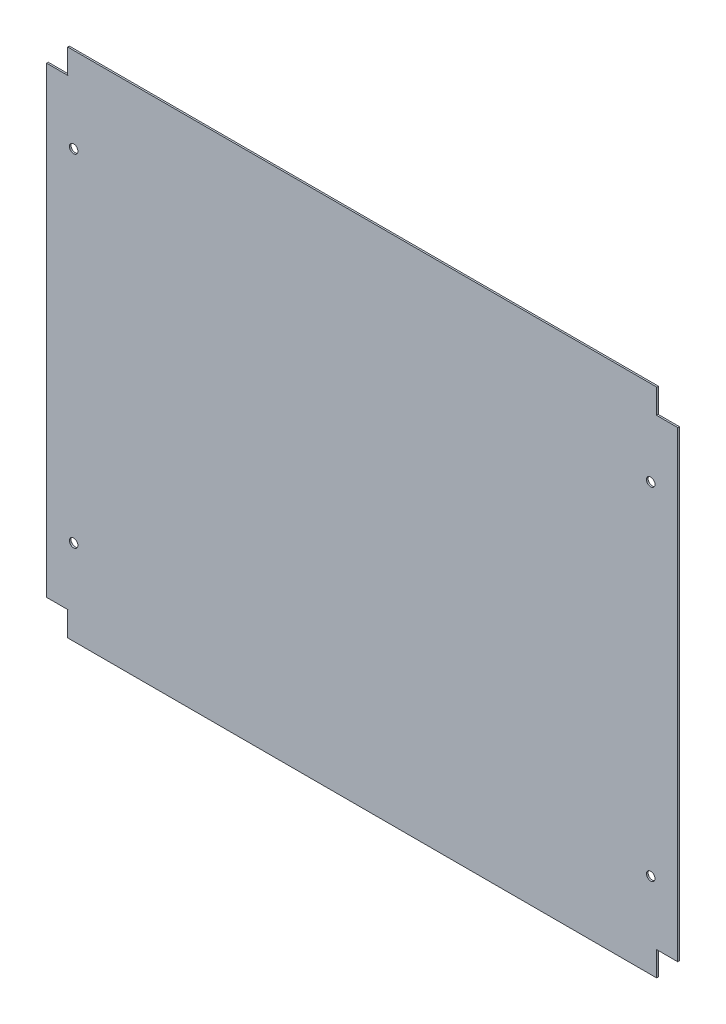
ISO-10303-21;
HEADER;
FILE_DESCRIPTION(('STEP AP214'),'2;1');
FILE_NAME('part.step','',(''),(''),'','','');
FILE_SCHEMA(('AUTOMOTIVE_DESIGN { 1 0 10303 214 1 1 1 1 }'));
ENDSEC;
DATA;
#1=APPLICATION_CONTEXT('core data for automotive mechanical design processes');
#2=APPLICATION_PROTOCOL_DEFINITION('international standard','automotive_design',2000,#1);
#3=PRODUCT_CONTEXT('',#1,'mechanical');
#4=PRODUCT('Part','Part','',(#3));
#5=PRODUCT_RELATED_PRODUCT_CATEGORY('part','',(#4));
#6=PRODUCT_DEFINITION_FORMATION('','',#4);
#7=PRODUCT_DEFINITION_CONTEXT('part definition',#1,'design');
#8=PRODUCT_DEFINITION('design','',#6,#7);
#9=PRODUCT_DEFINITION_SHAPE('','',#8);
#10=(LENGTH_UNIT() NAMED_UNIT(*) SI_UNIT(.MILLI.,.METRE.));
#11=(NAMED_UNIT(*) PLANE_ANGLE_UNIT() SI_UNIT($,.RADIAN.));
#12=(NAMED_UNIT(*) SI_UNIT($,.STERADIAN.) SOLID_ANGLE_UNIT());
#13=UNCERTAINTY_MEASURE_WITH_UNIT(LENGTH_MEASURE(1.E-05),#10,'distance_accuracy_value','');
#14=(GEOMETRIC_REPRESENTATION_CONTEXT(3) GLOBAL_UNCERTAINTY_ASSIGNED_CONTEXT((#13)) GLOBAL_UNIT_ASSIGNED_CONTEXT((#10,
#11,#12)) REPRESENTATION_CONTEXT('',''));
#15=CARTESIAN_POINT('',(0.,0.,0.));
#16=DIRECTION('',(0.,0.,1.));
#17=DIRECTION('',(1.,0.,0.));
#18=AXIS2_PLACEMENT_3D('',#15,#16,#17);
#19=CARTESIAN_POINT('',(-273.7866,215.2904,-1.52399999999997));
#20=DIRECTION('',(-1.,0.,0.));
#21=DIRECTION('',(0.,0.,1.));
#22=AXIS2_PLACEMENT_3D('',#19,#20,#21);
#23=PLANE('',#22);
#24=DIRECTION('',(0.,0.,1.));
#25=VECTOR('',#24,1.);
#26=CARTESIAN_POINT('',(-273.7866,215.138,-1.52399999999997));
#27=LINE('',#26,#25);
#28=CARTESIAN_POINT('',(-273.7866,215.138,-1.524));
#29=VERTEX_POINT('',#28);
#30=CARTESIAN_POINT('',(-273.7866,215.138,0.));
#31=VERTEX_POINT('',#30);
#32=EDGE_CURVE('E391',#29,#31,#27,.T.);
#33=ORIENTED_EDGE('',*,*,#32,.T.);
#34=DIRECTION('',(0.,1.,0.));
#35=VECTOR('',#34,1.);
#36=CARTESIAN_POINT('',(-273.7866,0.,0.));
#37=LINE('',#36,#35);
#38=CARTESIAN_POINT('',(-273.7866,215.2904,0.));
#39=VERTEX_POINT('',#38);
#40=EDGE_CURVE('E13',#31,#39,#37,.T.);
#41=ORIENTED_EDGE('',*,*,#40,.T.);
#42=DIRECTION('',(0.,0.,1.));
#43=VECTOR('',#42,1.);
#44=CARTESIAN_POINT('',(-273.7866,215.2904,-1.52399999999997));
#45=LINE('',#44,#43);
#46=CARTESIAN_POINT('',(-273.7866,215.2904,-1.524));
#47=VERTEX_POINT('',#46);
#48=EDGE_CURVE('E388',#47,#39,#45,.T.);
#49=ORIENTED_EDGE('',*,*,#48,.F.);
#50=DIRECTION('',(0.,-1.,0.));
#51=VECTOR('',#50,1.);
#52=CARTESIAN_POINT('',(-273.7866,215.2904,-1.52399999999997));
#53=LINE('',#52,#51);
#54=EDGE_CURVE('E146',#47,#29,#53,.T.);
#55=ORIENTED_EDGE('',*,*,#54,.T.);
#56=EDGE_LOOP('',(#33,#41,#49,#55));
#57=FACE_BOUND('',#56,.T.);
#58=ADVANCED_FACE('F130',(#57),#23,.T.);
#59=CARTESIAN_POINT('',(-273.7866,-215.138,-1.52399999999997));
#60=DIRECTION('',(-1.,0.,0.));
#61=DIRECTION('',(0.,0.,1.));
#62=AXIS2_PLACEMENT_3D('',#59,#60,#61);
#63=PLANE('',#62);
#64=DIRECTION('',(0.,0.,1.));
#65=VECTOR('',#64,1.);
#66=CARTESIAN_POINT('',(-273.7866,-215.2904,-1.52399999999997));
#67=LINE('',#66,#65);
#68=CARTESIAN_POINT('',(-273.7866,-215.2904,-1.524));
#69=VERTEX_POINT('',#68);
#70=CARTESIAN_POINT('',(-273.7866,-215.2904,0.));
#71=VERTEX_POINT('',#70);
#72=EDGE_CURVE('E378',#69,#71,#67,.T.);
#73=ORIENTED_EDGE('',*,*,#72,.T.);
#74=DIRECTION('',(0.,1.,0.));
#75=VECTOR('',#74,1.);
#76=CARTESIAN_POINT('',(-273.7866,0.,0.));
#77=LINE('',#76,#75);
#78=CARTESIAN_POINT('',(-273.7866,-215.138,0.));
#79=VERTEX_POINT('',#78);
#80=EDGE_CURVE('E139',#71,#79,#77,.T.);
#81=ORIENTED_EDGE('',*,*,#80,.T.);
#82=DIRECTION('',(0.,0.,1.));
#83=VECTOR('',#82,1.);
#84=CARTESIAN_POINT('',(-273.7866,-215.138,-1.52399999999997));
#85=LINE('',#84,#83);
#86=CARTESIAN_POINT('',(-273.7866,-215.138,-1.524));
#87=VERTEX_POINT('',#86);
#88=EDGE_CURVE('E400',#87,#79,#85,.T.);
#89=ORIENTED_EDGE('',*,*,#88,.F.);
#90=DIRECTION('',(0.,-1.,0.));
#91=VECTOR('',#90,1.);
#92=CARTESIAN_POINT('',(-273.7866,-215.138,-1.52399999999997));
#93=LINE('',#92,#91);
#94=EDGE_CURVE('E396',#87,#69,#93,.T.);
#95=ORIENTED_EDGE('',*,*,#94,.T.);
#96=EDGE_LOOP('',(#73,#81,#89,#95));
#97=FACE_BOUND('',#96,.T.);
#98=ADVANCED_FACE('F529',(#97),#63,.T.);
#99=CARTESIAN_POINT('',(-273.7866,-215.2904,-1.52399999999997));
#100=DIRECTION('',(0.,1.,0.));
#101=DIRECTION('',(0.,0.,1.));
#102=AXIS2_PLACEMENT_3D('',#99,#100,#101);
#103=PLANE('',#102);
#104=DIRECTION('',(0.,0.,1.));
#105=VECTOR('',#104,1.);
#106=CARTESIAN_POINT('',(-273.939,-215.2904,-1.525));
#107=LINE('',#106,#105);
#108=CARTESIAN_POINT('',(-273.939,-215.2904,-1.524));
#109=VERTEX_POINT('',#108);
#110=CARTESIAN_POINT('',(-273.939,-215.2904,0.));
#111=VERTEX_POINT('',#110);
#112=EDGE_CURVE('E521',#109,#111,#107,.T.);
#113=ORIENTED_EDGE('',*,*,#112,.T.);
#114=DIRECTION('',(1.,0.,0.));
#115=VECTOR('',#114,1.);
#116=CARTESIAN_POINT('',(0.,-215.2904,0.));
#117=LINE('',#116,#115);
#118=EDGE_CURVE('E425',#111,#71,#117,.T.);
#119=ORIENTED_EDGE('',*,*,#118,.T.);
#120=ORIENTED_EDGE('',*,*,#72,.F.);
#121=DIRECTION('',(-1.,0.,0.));
#122=VECTOR('',#121,1.);
#123=CARTESIAN_POINT('',(-273.7866,-215.2904,-1.52399999999997));
#124=LINE('',#123,#122);
#125=EDGE_CURVE('E401',#69,#109,#124,.T.);
#126=ORIENTED_EDGE('',*,*,#125,.T.);
#127=EDGE_LOOP('',(#113,#119,#120,#126));
#128=FACE_BOUND('',#127,.T.);
#129=ADVANCED_FACE('F537',(#128),#103,.T.);
#130=CARTESIAN_POINT('',(-276.987,215.2904,-1.52399999999997));
#131=DIRECTION('',(0.,-1.,0.));
#132=DIRECTION('',(0.,0.,-1.));
#133=AXIS2_PLACEMENT_3D('',#130,#131,#132);
#134=PLANE('',#133);
#135=ORIENTED_EDGE('',*,*,#48,.T.);
#136=DIRECTION('',(-1.,0.,0.));
#137=VECTOR('',#136,1.);
#138=CARTESIAN_POINT('',(0.,215.2904,0.));
#139=LINE('',#138,#137);
#140=CARTESIAN_POINT('',(-273.939,215.2904,0.));
#141=VERTEX_POINT('',#140);
#142=EDGE_CURVE('E421',#39,#141,#139,.T.);
#143=ORIENTED_EDGE('',*,*,#142,.T.);
#144=DIRECTION('',(0.,0.,-1.));
#145=VECTOR('',#144,1.);
#146=CARTESIAN_POINT('',(-273.939,215.2904,-1.525));
#147=LINE('',#146,#145);
#148=CARTESIAN_POINT('',(-273.939,215.2904,-1.52399999999997));
#149=VERTEX_POINT('',#148);
#150=EDGE_CURVE('E517',#141,#149,#147,.T.);
#151=ORIENTED_EDGE('',*,*,#150,.T.);
#152=DIRECTION('',(1.,0.,0.));
#153=VECTOR('',#152,1.);
#154=CARTESIAN_POINT('',(-276.987,215.2904,-1.52399999999997));
#155=LINE('',#154,#153);
#156=EDGE_CURVE('E382',#149,#47,#155,.T.);
#157=ORIENTED_EDGE('',*,*,#156,.T.);
#158=EDGE_LOOP('',(#135,#143,#151,#157));
#159=FACE_BOUND('',#158,.T.);
#160=ADVANCED_FACE('F590',(#159),#134,.T.);
#161=CARTESIAN_POINT('',(-273.7866,215.138,-1.52399999999997));
#162=DIRECTION('',(0.,1.,0.));
#163=DIRECTION('',(0.,0.,1.));
#164=AXIS2_PLACEMENT_3D('',#161,#162,#163);
#165=PLANE('',#164);
#166=DIRECTION('',(-1.,0.,0.));
#167=VECTOR('',#166,1.);
#168=CARTESIAN_POINT('',(-273.7866,215.138,-1.52399999999997));
#169=LINE('',#168,#167);
#170=CARTESIAN_POINT('',(-293.483962531012,215.138,-1.52399999999991));
#171=VERTEX_POINT('',#170);
#172=EDGE_CURVE('E151',#29,#171,#169,.T.);
#173=ORIENTED_EDGE('',*,*,#172,.T.);
#174=DIRECTION('',(0.,0.,-1.));
#175=VECTOR('',#174,1.);
#176=CARTESIAN_POINT('',(-293.483962531012,215.138,1.11022302462516E-13));
#177=LINE('',#176,#175);
#178=CARTESIAN_POINT('',(-293.483962531012,215.138,1.11022302462516E-13));
#179=VERTEX_POINT('',#178);
#180=EDGE_CURVE('E343',#179,#171,#177,.T.);
#181=ORIENTED_EDGE('',*,*,#180,.F.);
#182=DIRECTION('',(1.,0.,0.));
#183=VECTOR('',#182,1.);
#184=CARTESIAN_POINT('',(0.,215.138,0.));
#185=LINE('',#184,#183);
#186=EDGE_CURVE('E418',#179,#31,#185,.T.);
#187=ORIENTED_EDGE('',*,*,#186,.T.);
#188=ORIENTED_EDGE('',*,*,#32,.F.);
#189=EDGE_LOOP('',(#173,#181,#187,#188));
#190=FACE_BOUND('',#189,.T.);
#191=ADVANCED_FACE('F588',(#190),#165,.T.);
#192=CARTESIAN_POINT('',(-273.939,-215.138,-1.52399999999997));
#193=DIRECTION('',(0.,-1.,0.));
#194=DIRECTION('',(0.,0.,-1.));
#195=AXIS2_PLACEMENT_3D('',#192,#193,#194);
#196=PLANE('',#195);
#197=ORIENTED_EDGE('',*,*,#88,.T.);
#198=DIRECTION('',(-1.,0.,0.));
#199=VECTOR('',#198,1.);
#200=CARTESIAN_POINT('',(0.,-215.138,0.));
#201=LINE('',#200,#199);
#202=CARTESIAN_POINT('',(-293.483962531012,-215.138,1.11022302462516E-13));
#203=VERTEX_POINT('',#202);
#204=EDGE_CURVE('E385',#79,#203,#201,.T.);
#205=ORIENTED_EDGE('',*,*,#204,.T.);
#206=DIRECTION('',(0.,0.,-1.));
#207=VECTOR('',#206,1.);
#208=CARTESIAN_POINT('',(-293.483962531012,-215.138,1.11022302462516E-13));
#209=LINE('',#208,#207);
#210=CARTESIAN_POINT('',(-293.483962531012,-215.138,-1.52399999999991));
#211=VERTEX_POINT('',#210);
#212=EDGE_CURVE('E335',#203,#211,#209,.T.);
#213=ORIENTED_EDGE('',*,*,#212,.T.);
#214=DIRECTION('',(1.,0.,0.));
#215=VECTOR('',#214,1.);
#216=CARTESIAN_POINT('',(-273.939,-215.138,-1.52399999999997));
#217=LINE('',#216,#215);
#218=EDGE_CURVE('E392',#211,#87,#217,.T.);
#219=ORIENTED_EDGE('',*,*,#218,.T.);
#220=EDGE_LOOP('',(#197,#205,#213,#219));
#221=FACE_BOUND('',#220,.T.);
#222=ADVANCED_FACE('F532',(#221),#196,.T.);
#223=CARTESIAN_POINT('',(0.,0.,-1.524));
#224=DIRECTION('',(0.,0.,-1.));
#225=DIRECTION('',(-1.,0.,0.));
#226=AXIS2_PLACEMENT_3D('',#223,#224,#225);
#227=PLANE('',#226);
#228=CARTESIAN_POINT('',(268.351,158.75,-1.524));
#229=DIRECTION('',(0.,0.,-1.));
#230=DIRECTION('',(-1.,0.,0.));
#231=AXIS2_PLACEMENT_3D('',#228,#229,#230);
#232=CIRCLE('',#231,3.96240000000001);
#233=CARTESIAN_POINT('',(264.3886,158.75,-1.524));
#234=VERTEX_POINT('',#233);
#235=EDGE_CURVE('E358',#234,#234,#232,.F.);
#236=ORIENTED_EDGE('',*,*,#235,.T.);
#237=EDGE_LOOP('',(#236));
#238=FACE_BOUND('',#237,.T.);
#239=CARTESIAN_POINT('',(-268.351,-158.75,-1.524));
#240=DIRECTION('',(0.,0.,-1.));
#241=DIRECTION('',(-1.,0.,0.));
#242=AXIS2_PLACEMENT_3D('',#239,#240,#241);
#243=CIRCLE('',#242,3.96240000000001);
#244=CARTESIAN_POINT('',(-272.3134,-158.75,-1.524));
#245=VERTEX_POINT('',#244);
#246=EDGE_CURVE('E367',#245,#245,#243,.F.);
#247=ORIENTED_EDGE('',*,*,#246,.T.);
#248=EDGE_LOOP('',(#247));
#249=FACE_BOUND('',#248,.T.);
#250=CARTESIAN_POINT('',(268.351,-158.75,-1.524));
#251=DIRECTION('',(0.,0.,-1.));
#252=DIRECTION('',(-1.,0.,0.));
#253=AXIS2_PLACEMENT_3D('',#250,#251,#252);
#254=CIRCLE('',#253,3.96240000000001);
#255=CARTESIAN_POINT('',(264.3886,-158.75,-1.524));
#256=VERTEX_POINT('',#255);
#257=EDGE_CURVE('E350',#256,#256,#254,.F.);
#258=ORIENTED_EDGE('',*,*,#257,.T.);
#259=EDGE_LOOP('',(#258));
#260=FACE_BOUND('',#259,.T.);
#261=CARTESIAN_POINT('',(-268.351,158.75,-1.524));
#262=DIRECTION('',(0.,0.,-1.));
#263=DIRECTION('',(-1.,0.,0.));
#264=AXIS2_PLACEMENT_3D('',#261,#262,#263);
#265=CIRCLE('',#264,3.96240000000001);
#266=CARTESIAN_POINT('',(-272.3134,158.75,-1.524));
#267=VERTEX_POINT('',#266);
#268=EDGE_CURVE('E362',#267,#267,#265,.F.);
#269=ORIENTED_EDGE('',*,*,#268,.T.);
#270=EDGE_LOOP('',(#269));
#271=FACE_BOUND('',#270,.T.);
#272=ORIENTED_EDGE('',*,*,#54,.F.);
#273=ORIENTED_EDGE('',*,*,#156,.F.);
#274=DIRECTION('',(0.,1.,0.));
#275=VECTOR('',#274,1.);
#276=CARTESIAN_POINT('',(-273.939,221.488,-1.524));
#277=LINE('',#276,#275);
#278=CARTESIAN_POINT('',(-273.939,237.984962531012,-1.52399999999991));
#279=VERTEX_POINT('',#278);
#280=EDGE_CURVE('E490',#149,#279,#277,.T.);
#281=ORIENTED_EDGE('',*,*,#280,.T.);
#282=DIRECTION('',(-1.,0.,0.));
#283=VECTOR('',#282,1.);
#284=CARTESIAN_POINT('',(0.,237.984962531012,-1.52399999999991));
#285=LINE('',#284,#283);
#286=CARTESIAN_POINT('',(273.939,237.984962531012,-1.52399999999991));
#287=VERTEX_POINT('',#286);
#288=EDGE_CURVE('E289',#279,#287,#285,.F.);
#289=ORIENTED_EDGE('',*,*,#288,.T.);
#290=DIRECTION('',(0.,-1.,0.));
#291=VECTOR('',#290,1.);
#292=CARTESIAN_POINT('',(273.939,221.488,-1.524));
#293=LINE('',#292,#291);
#294=CARTESIAN_POINT('',(273.939,215.2904,-1.524));
#295=VERTEX_POINT('',#294);
#296=EDGE_CURVE('E278',#287,#295,#293,.T.);
#297=ORIENTED_EDGE('',*,*,#296,.T.);
#298=DIRECTION('',(1.,0.,0.));
#299=VECTOR('',#298,1.);
#300=CARTESIAN_POINT('',(273.7866,215.2904,-1.52399999999997));
#301=LINE('',#300,#299);
#302=CARTESIAN_POINT('',(273.7866,215.2904,-1.524));
#303=VERTEX_POINT('',#302);
#304=EDGE_CURVE('E453',#303,#295,#301,.T.);
#305=ORIENTED_EDGE('',*,*,#304,.F.);
#306=DIRECTION('',(0.,1.,0.));
#307=VECTOR('',#306,1.);
#308=CARTESIAN_POINT('',(273.7866,215.138,-1.52399999999997));
#309=LINE('',#308,#307);
#310=CARTESIAN_POINT('',(273.7866,215.138,-1.524));
#311=VERTEX_POINT('',#310);
#312=EDGE_CURVE('E448',#311,#303,#309,.T.);
#313=ORIENTED_EDGE('',*,*,#312,.F.);
#314=DIRECTION('',(-1.,0.,0.));
#315=VECTOR('',#314,1.);
#316=CARTESIAN_POINT('',(273.939,215.138,-1.52399999999997));
#317=LINE('',#316,#315);
#318=CARTESIAN_POINT('',(293.483962531012,215.138,-1.52399999999991));
#319=VERTEX_POINT('',#318);
#320=EDGE_CURVE('E444',#319,#311,#317,.T.);
#321=ORIENTED_EDGE('',*,*,#320,.F.);
#322=DIRECTION('',(0.,-1.,0.));
#323=VECTOR('',#322,1.);
#324=CARTESIAN_POINT('',(293.483962531012,0.,-1.52399999999991));
#325=LINE('',#324,#323);
#326=CARTESIAN_POINT('',(293.483962531012,-215.138,-1.52399999999991));
#327=VERTEX_POINT('',#326);
#328=EDGE_CURVE('E307',#319,#327,#325,.T.);
#329=ORIENTED_EDGE('',*,*,#328,.T.);
#330=DIRECTION('',(1.,0.,0.));
#331=VECTOR('',#330,1.);
#332=CARTESIAN_POINT('',(273.7866,-215.138,-1.52399999999997));
#333=LINE('',#332,#331);
#334=CARTESIAN_POINT('',(273.7866,-215.138,-1.524));
#335=VERTEX_POINT('',#334);
#336=EDGE_CURVE('E440',#335,#327,#333,.T.);
#337=ORIENTED_EDGE('',*,*,#336,.F.);
#338=DIRECTION('',(0.,1.,0.));
#339=VECTOR('',#338,1.);
#340=CARTESIAN_POINT('',(273.7866,-215.2904,-1.52399999999997));
#341=LINE('',#340,#339);
#342=CARTESIAN_POINT('',(273.7866,-215.2904,-1.524));
#343=VERTEX_POINT('',#342);
#344=EDGE_CURVE('E435',#343,#335,#341,.T.);
#345=ORIENTED_EDGE('',*,*,#344,.F.);
#346=DIRECTION('',(-1.,0.,0.));
#347=VECTOR('',#346,1.);
#348=CARTESIAN_POINT('',(276.987,-215.2904,-1.52399999999997));
#349=LINE('',#348,#347);
#350=CARTESIAN_POINT('',(273.939,-215.2904,-1.52399999999997));
#351=VERTEX_POINT('',#350);
#352=EDGE_CURVE('E430',#351,#343,#349,.T.);
#353=ORIENTED_EDGE('',*,*,#352,.F.);
#354=DIRECTION('',(0.,-1.,0.));
#355=VECTOR('',#354,1.);
#356=CARTESIAN_POINT('',(273.939,-221.488,-1.524));
#357=LINE('',#356,#355);
#358=CARTESIAN_POINT('',(273.939,-237.984962531012,-1.52399999999989));
#359=VERTEX_POINT('',#358);
#360=EDGE_CURVE('E484',#351,#359,#357,.T.);
#361=ORIENTED_EDGE('',*,*,#360,.T.);
#362=DIRECTION('',(-1.,0.,0.));
#363=VECTOR('',#362,1.);
#364=CARTESIAN_POINT('',(0.,-237.984962531012,-1.52399999999989));
#365=LINE('',#364,#363);
#366=CARTESIAN_POINT('',(-273.939,-237.984962531012,-1.52399999999989));
#367=VERTEX_POINT('',#366);
#368=EDGE_CURVE('E324',#359,#367,#365,.T.);
#369=ORIENTED_EDGE('',*,*,#368,.T.);
#370=DIRECTION('',(0.,1.,0.));
#371=VECTOR('',#370,1.);
#372=CARTESIAN_POINT('',(-273.939,-221.488,-1.524));
#373=LINE('',#372,#371);
#374=EDGE_CURVE('E279',#367,#109,#373,.T.);
#375=ORIENTED_EDGE('',*,*,#374,.T.);
#376=ORIENTED_EDGE('',*,*,#125,.F.);
#377=ORIENTED_EDGE('',*,*,#94,.F.);
#378=ORIENTED_EDGE('',*,*,#218,.F.);
#379=DIRECTION('',(0.,1.,0.));
#380=VECTOR('',#379,1.);
#381=CARTESIAN_POINT('',(-293.483962531012,0.,-1.52399999999991));
#382=LINE('',#381,#380);
#383=EDGE_CURVE('E340',#211,#171,#382,.T.);
#384=ORIENTED_EDGE('',*,*,#383,.T.);
#385=ORIENTED_EDGE('',*,*,#172,.F.);
#386=EDGE_LOOP('',(#272,#273,#281,#289,#297,#305,#313,#321,#329,#337,#345,#353,#361,#369,#375,
#376,#377,#378,#384,#385));
#387=FACE_BOUND('',#386,.T.);
#388=ADVANCED_FACE('F535',(#238,#249,#260,#271,#387),#227,.T.);
#389=CARTESIAN_POINT('',(0.,0.,0.));
#390=DIRECTION('',(0.,0.,-1.));
#391=DIRECTION('',(-1.,0.,0.));
#392=AXIS2_PLACEMENT_3D('',#389,#390,#391);
#393=PLANE('',#392);
#394=CARTESIAN_POINT('',(268.351,158.75,0.));
#395=DIRECTION('',(0.,0.,1.));
#396=DIRECTION('',(1.,0.,0.));
#397=AXIS2_PLACEMENT_3D('',#394,#395,#396);
#398=CIRCLE('',#397,3.96240000000001);
#399=CARTESIAN_POINT('',(272.3134,158.75,0.));
#400=VERTEX_POINT('',#399);
#401=EDGE_CURVE('E363',#400,#400,#398,.T.);
#402=ORIENTED_EDGE('',*,*,#401,.F.);
#403=EDGE_LOOP('',(#402));
#404=FACE_BOUND('',#403,.T.);
#405=CARTESIAN_POINT('',(-268.351,-158.75,0.));
#406=DIRECTION('',(0.,0.,1.));
#407=DIRECTION('',(1.,0.,0.));
#408=AXIS2_PLACEMENT_3D('',#405,#406,#407);
#409=CIRCLE('',#408,3.96240000000001);
#410=CARTESIAN_POINT('',(-264.3886,-158.75,0.));
#411=VERTEX_POINT('',#410);
#412=EDGE_CURVE('E354',#411,#411,#409,.T.);
#413=ORIENTED_EDGE('',*,*,#412,.F.);
#414=EDGE_LOOP('',(#413));
#415=FACE_BOUND('',#414,.T.);
#416=CARTESIAN_POINT('',(268.351,-158.75,0.));
#417=DIRECTION('',(0.,0.,1.));
#418=DIRECTION('',(1.,0.,0.));
#419=AXIS2_PLACEMENT_3D('',#416,#417,#418);
#420=CIRCLE('',#419,3.96240000000001);
#421=CARTESIAN_POINT('',(272.3134,-158.75,0.));
#422=VERTEX_POINT('',#421);
#423=EDGE_CURVE('E339',#422,#422,#420,.T.);
#424=ORIENTED_EDGE('',*,*,#423,.F.);
#425=EDGE_LOOP('',(#424));
#426=FACE_BOUND('',#425,.T.);
#427=CARTESIAN_POINT('',(-268.351,158.75,0.));
#428=DIRECTION('',(0.,0.,1.));
#429=DIRECTION('',(1.,0.,0.));
#430=AXIS2_PLACEMENT_3D('',#427,#428,#429);
#431=CIRCLE('',#430,3.96240000000001);
#432=CARTESIAN_POINT('',(-264.3886,158.75,0.));
#433=VERTEX_POINT('',#432);
#434=EDGE_CURVE('E374',#433,#433,#431,.T.);
#435=ORIENTED_EDGE('',*,*,#434,.F.);
#436=EDGE_LOOP('',(#435));
#437=FACE_BOUND('',#436,.T.);
#438=ORIENTED_EDGE('',*,*,#142,.F.);
#439=ORIENTED_EDGE('',*,*,#40,.F.);
#440=ORIENTED_EDGE('',*,*,#186,.F.);
#441=DIRECTION('',(0.,-1.,0.));
#442=VECTOR('',#441,1.);
#443=CARTESIAN_POINT('',(-293.483962531012,-215.138,1.11022302462516E-13));
#444=LINE('',#443,#442);
#445=EDGE_CURVE('E323',#203,#179,#444,.F.);
#446=ORIENTED_EDGE('',*,*,#445,.F.);
#447=ORIENTED_EDGE('',*,*,#204,.F.);
#448=ORIENTED_EDGE('',*,*,#80,.F.);
#449=ORIENTED_EDGE('',*,*,#118,.F.);
#450=DIRECTION('',(0.,1.,0.));
#451=VECTOR('',#450,1.);
#452=CARTESIAN_POINT('',(-273.939,-221.488,0.));
#453=LINE('',#452,#451);
#454=CARTESIAN_POINT('',(-273.939,-237.984962531012,1.11022302462516E-13));
#455=VERTEX_POINT('',#454);
#456=EDGE_CURVE('E486',#455,#111,#453,.T.);
#457=ORIENTED_EDGE('',*,*,#456,.F.);
#458=DIRECTION('',(1.,0.,0.));
#459=VECTOR('',#458,1.);
#460=CARTESIAN_POINT('',(273.939,-237.984962531012,1.11022302462516E-13));
#461=LINE('',#460,#459);
#462=CARTESIAN_POINT('',(273.939,-237.984962531012,1.11022302462516E-13));
#463=VERTEX_POINT('',#462);
#464=EDGE_CURVE('E306',#463,#455,#461,.F.);
#465=ORIENTED_EDGE('',*,*,#464,.F.);
#466=DIRECTION('',(0.,-1.,0.));
#467=VECTOR('',#466,1.);
#468=CARTESIAN_POINT('',(273.939,-221.488,0.));
#469=LINE('',#468,#467);
#470=CARTESIAN_POINT('',(273.939,-215.2904,0.));
#471=VERTEX_POINT('',#470);
#472=EDGE_CURVE('E481',#471,#463,#469,.T.);
#473=ORIENTED_EDGE('',*,*,#472,.F.);
#474=DIRECTION('',(1.,0.,0.));
#475=VECTOR('',#474,1.);
#476=CARTESIAN_POINT('',(0.,-215.2904,0.));
#477=LINE('',#476,#475);
#478=CARTESIAN_POINT('',(273.7866,-215.2904,0.));
#479=VERTEX_POINT('',#478);
#480=EDGE_CURVE('E475',#479,#471,#477,.T.);
#481=ORIENTED_EDGE('',*,*,#480,.F.);
#482=DIRECTION('',(0.,-1.,0.));
#483=VECTOR('',#482,1.);
#484=CARTESIAN_POINT('',(273.7866,0.,0.));
#485=LINE('',#484,#483);
#486=CARTESIAN_POINT('',(273.7866,-215.138,0.));
#487=VERTEX_POINT('',#486);
#488=EDGE_CURVE('E513',#487,#479,#485,.T.);
#489=ORIENTED_EDGE('',*,*,#488,.F.);
#490=DIRECTION('',(-1.,0.,0.));
#491=VECTOR('',#490,1.);
#492=CARTESIAN_POINT('',(0.,-215.138,0.));
#493=LINE('',#492,#491);
#494=CARTESIAN_POINT('',(293.483962531012,-215.138,1.11022302462516E-13));
#495=VERTEX_POINT('',#494);
#496=EDGE_CURVE('E471',#495,#487,#493,.T.);
#497=ORIENTED_EDGE('',*,*,#496,.F.);
#498=DIRECTION('',(0.,1.,0.));
#499=VECTOR('',#498,1.);
#500=CARTESIAN_POINT('',(293.483962531012,215.138,1.11022302462516E-13));
#501=LINE('',#500,#499);
#502=CARTESIAN_POINT('',(293.483962531012,215.138,1.11022302462516E-13));
#503=VERTEX_POINT('',#502);
#504=EDGE_CURVE('E315',#503,#495,#501,.F.);
#505=ORIENTED_EDGE('',*,*,#504,.F.);
#506=DIRECTION('',(1.,0.,0.));
#507=VECTOR('',#506,1.);
#508=CARTESIAN_POINT('',(0.,215.138,0.));
#509=LINE('',#508,#507);
#510=CARTESIAN_POINT('',(273.7866,215.138,0.));
#511=VERTEX_POINT('',#510);
#512=EDGE_CURVE('E434',#511,#503,#509,.T.);
#513=ORIENTED_EDGE('',*,*,#512,.F.);
#514=DIRECTION('',(0.,-1.,0.));
#515=VECTOR('',#514,1.);
#516=CARTESIAN_POINT('',(273.7866,0.,0.));
#517=LINE('',#516,#515);
#518=CARTESIAN_POINT('',(273.7866,215.2904,0.));
#519=VERTEX_POINT('',#518);
#520=EDGE_CURVE('E509',#519,#511,#517,.T.);
#521=ORIENTED_EDGE('',*,*,#520,.F.);
#522=DIRECTION('',(-1.,0.,0.));
#523=VECTOR('',#522,1.);
#524=CARTESIAN_POINT('',(0.,215.2904,0.));
#525=LINE('',#524,#523);
#526=CARTESIAN_POINT('',(273.939,215.2904,0.));
#527=VERTEX_POINT('',#526);
#528=EDGE_CURVE('E274',#527,#519,#525,.T.);
#529=ORIENTED_EDGE('',*,*,#528,.F.);
#530=DIRECTION('',(0.,-1.,0.));
#531=VECTOR('',#530,1.);
#532=CARTESIAN_POINT('',(273.939,221.488,0.));
#533=LINE('',#532,#531);
#534=CARTESIAN_POINT('',(273.939,237.984962531012,0.));
#535=VERTEX_POINT('',#534);
#536=EDGE_CURVE('E268',#535,#527,#533,.T.);
#537=ORIENTED_EDGE('',*,*,#536,.F.);
#538=DIRECTION('',(1.,0.,0.));
#539=VECTOR('',#538,1.);
#540=CARTESIAN_POINT('',(273.939,237.984962531012,0.));
#541=LINE('',#540,#539);
#542=CARTESIAN_POINT('',(-273.939,237.984962531012,1.11022302462516E-13));
#543=VERTEX_POINT('',#542);
#544=EDGE_CURVE('E272',#543,#535,#541,.T.);
#545=ORIENTED_EDGE('',*,*,#544,.F.);
#546=DIRECTION('',(0.,1.,0.));
#547=VECTOR('',#546,1.);
#548=CARTESIAN_POINT('',(-273.939,221.488,0.));
#549=LINE('',#548,#547);
#550=EDGE_CURVE('E499',#141,#543,#549,.T.);
#551=ORIENTED_EDGE('',*,*,#550,.F.);
#552=EDGE_LOOP('',(#438,#439,#440,#446,#447,#448,#449,#457,#465,#473,#481,#489,#497,#505,#513,
#521,#529,#537,#545,#551));
#553=FACE_BOUND('',#552,.T.);
#554=ADVANCED_FACE('F132',(#404,#415,#426,#437,#553),#393,.F.);
#555=CARTESIAN_POINT('',(-273.939,-221.488,-1.525));
#556=DIRECTION('',(1.,0.,0.));
#557=DIRECTION('',(0.,0.,-1.));
#558=AXIS2_PLACEMENT_3D('',#555,#556,#557);
#559=PLANE('',#558);
#560=ORIENTED_EDGE('',*,*,#112,.F.);
#561=ORIENTED_EDGE('',*,*,#374,.F.);
#562=DIRECTION('',(0.,0.,-1.));
#563=VECTOR('',#562,1.);
#564=CARTESIAN_POINT('',(-273.939,-237.984962531012,1.11022302462516E-13));
#565=LINE('',#564,#563);
#566=EDGE_CURVE('E328',#455,#367,#565,.T.);
#567=ORIENTED_EDGE('',*,*,#566,.F.);
#568=ORIENTED_EDGE('',*,*,#456,.T.);
#569=EDGE_LOOP('',(#560,#561,#567,#568));
#570=FACE_BOUND('',#569,.T.);
#571=ADVANCED_FACE('F541',(#570),#559,.F.);
#572=CARTESIAN_POINT('',(-273.939,221.488,-1.525));
#573=DIRECTION('',(1.,0.,0.));
#574=DIRECTION('',(0.,0.,-1.));
#575=AXIS2_PLACEMENT_3D('',#572,#573,#574);
#576=PLANE('',#575);
#577=ORIENTED_EDGE('',*,*,#150,.F.);
#578=ORIENTED_EDGE('',*,*,#550,.T.);
#579=DIRECTION('',(0.,0.,-1.));
#580=VECTOR('',#579,1.);
#581=CARTESIAN_POINT('',(-273.939,237.984962531012,1.11022302462516E-13));
#582=LINE('',#581,#580);
#583=EDGE_CURVE('E294',#543,#279,#582,.T.);
#584=ORIENTED_EDGE('',*,*,#583,.T.);
#585=ORIENTED_EDGE('',*,*,#280,.F.);
#586=EDGE_LOOP('',(#577,#578,#584,#585));
#587=FACE_BOUND('',#586,.T.);
#588=ADVANCED_FACE('F638',(#587),#576,.F.);
#589=CARTESIAN_POINT('',(273.939,-221.488,-1.525));
#590=DIRECTION('',(-1.,0.,0.));
#591=DIRECTION('',(0.,0.,1.));
#592=AXIS2_PLACEMENT_3D('',#589,#590,#591);
#593=PLANE('',#592);
#594=ORIENTED_EDGE('',*,*,#472,.T.);
#595=DIRECTION('',(0.,0.,-1.));
#596=VECTOR('',#595,1.);
#597=CARTESIAN_POINT('',(273.939,-237.984962531012,1.11022302462516E-13));
#598=LINE('',#597,#596);
#599=EDGE_CURVE('E319',#463,#359,#598,.T.);
#600=ORIENTED_EDGE('',*,*,#599,.T.);
#601=ORIENTED_EDGE('',*,*,#360,.F.);
#602=DIRECTION('',(0.,0.,-1.));
#603=VECTOR('',#602,1.);
#604=CARTESIAN_POINT('',(273.939,-215.2904,-1.525));
#605=LINE('',#604,#603);
#606=EDGE_CURVE('E502',#471,#351,#605,.T.);
#607=ORIENTED_EDGE('',*,*,#606,.F.);
#608=EDGE_LOOP('',(#594,#600,#601,#607));
#609=FACE_BOUND('',#608,.T.);
#610=ADVANCED_FACE('F641',(#609),#593,.F.);
#611=CARTESIAN_POINT('',(273.7866,-215.2904,-1.52399999999997));
#612=DIRECTION('',(1.,0.,0.));
#613=DIRECTION('',(0.,0.,-1.));
#614=AXIS2_PLACEMENT_3D('',#611,#612,#613);
#615=PLANE('',#614);
#616=DIRECTION('',(0.,0.,1.));
#617=VECTOR('',#616,1.);
#618=CARTESIAN_POINT('',(273.7866,-215.138,-1.52399999999997));
#619=LINE('',#618,#617);
#620=EDGE_CURVE('E443',#335,#487,#619,.T.);
#621=ORIENTED_EDGE('',*,*,#620,.T.);
#622=ORIENTED_EDGE('',*,*,#488,.T.);
#623=DIRECTION('',(0.,0.,1.));
#624=VECTOR('',#623,1.);
#625=CARTESIAN_POINT('',(273.7866,-215.2904,-1.52399999999997));
#626=LINE('',#625,#624);
#627=EDGE_CURVE('E439',#343,#479,#626,.T.);
#628=ORIENTED_EDGE('',*,*,#627,.F.);
#629=ORIENTED_EDGE('',*,*,#344,.T.);
#630=EDGE_LOOP('',(#621,#622,#628,#629));
#631=FACE_BOUND('',#630,.T.);
#632=ADVANCED_FACE('F553',(#631),#615,.T.);
#633=CARTESIAN_POINT('',(273.7866,215.138,-1.52399999999997));
#634=DIRECTION('',(1.,0.,0.));
#635=DIRECTION('',(0.,0.,-1.));
#636=AXIS2_PLACEMENT_3D('',#633,#634,#635);
#637=PLANE('',#636);
#638=DIRECTION('',(0.,0.,1.));
#639=VECTOR('',#638,1.);
#640=CARTESIAN_POINT('',(273.7866,215.2904,-1.52399999999997));
#641=LINE('',#640,#639);
#642=EDGE_CURVE('E429',#303,#519,#641,.T.);
#643=ORIENTED_EDGE('',*,*,#642,.T.);
#644=ORIENTED_EDGE('',*,*,#520,.T.);
#645=DIRECTION('',(0.,0.,1.));
#646=VECTOR('',#645,1.);
#647=CARTESIAN_POINT('',(273.7866,215.138,-1.52399999999997));
#648=LINE('',#647,#646);
#649=EDGE_CURVE('E452',#311,#511,#648,.T.);
#650=ORIENTED_EDGE('',*,*,#649,.F.);
#651=ORIENTED_EDGE('',*,*,#312,.T.);
#652=EDGE_LOOP('',(#643,#644,#650,#651));
#653=FACE_BOUND('',#652,.T.);
#654=ADVANCED_FACE('F566',(#653),#637,.T.);
#655=CARTESIAN_POINT('',(273.7866,215.2904,-1.52399999999997));
#656=DIRECTION('',(0.,-1.,0.));
#657=DIRECTION('',(0.,0.,-1.));
#658=AXIS2_PLACEMENT_3D('',#655,#656,#657);
#659=PLANE('',#658);
#660=DIRECTION('',(0.,0.,1.));
#661=VECTOR('',#660,1.);
#662=CARTESIAN_POINT('',(273.939,215.2904,-1.525));
#663=LINE('',#662,#661);
#664=EDGE_CURVE('E506',#295,#527,#663,.T.);
#665=ORIENTED_EDGE('',*,*,#664,.T.);
#666=ORIENTED_EDGE('',*,*,#528,.T.);
#667=ORIENTED_EDGE('',*,*,#642,.F.);
#668=ORIENTED_EDGE('',*,*,#304,.T.);
#669=EDGE_LOOP('',(#665,#666,#667,#668));
#670=FACE_BOUND('',#669,.T.);
#671=ADVANCED_FACE('F570',(#670),#659,.T.);
#672=CARTESIAN_POINT('',(276.987,-215.2904,-1.52399999999997));
#673=DIRECTION('',(0.,1.,0.));
#674=DIRECTION('',(0.,0.,1.));
#675=AXIS2_PLACEMENT_3D('',#672,#673,#674);
#676=PLANE('',#675);
#677=ORIENTED_EDGE('',*,*,#627,.T.);
#678=ORIENTED_EDGE('',*,*,#480,.T.);
#679=ORIENTED_EDGE('',*,*,#606,.T.);
#680=ORIENTED_EDGE('',*,*,#352,.T.);
#681=EDGE_LOOP('',(#677,#678,#679,#680));
#682=FACE_BOUND('',#681,.T.);
#683=ADVANCED_FACE('F549',(#682),#676,.T.);
#684=CARTESIAN_POINT('',(273.7866,-215.138,-1.52399999999997));
#685=DIRECTION('',(0.,-1.,0.));
#686=DIRECTION('',(0.,0.,-1.));
#687=AXIS2_PLACEMENT_3D('',#684,#685,#686);
#688=PLANE('',#687);
#689=ORIENTED_EDGE('',*,*,#336,.T.);
#690=DIRECTION('',(0.,0.,-1.));
#691=VECTOR('',#690,1.);
#692=CARTESIAN_POINT('',(293.483962531012,-215.138,1.11022302462516E-13));
#693=LINE('',#692,#691);
#694=EDGE_CURVE('E311',#495,#327,#693,.T.);
#695=ORIENTED_EDGE('',*,*,#694,.F.);
#696=ORIENTED_EDGE('',*,*,#496,.T.);
#697=ORIENTED_EDGE('',*,*,#620,.F.);
#698=EDGE_LOOP('',(#689,#695,#696,#697));
#699=FACE_BOUND('',#698,.T.);
#700=ADVANCED_FACE('F558',(#699),#688,.T.);
#701=CARTESIAN_POINT('',(273.939,215.138,-1.52399999999997));
#702=DIRECTION('',(0.,1.,0.));
#703=DIRECTION('',(0.,0.,1.));
#704=AXIS2_PLACEMENT_3D('',#701,#702,#703);
#705=PLANE('',#704);
#706=ORIENTED_EDGE('',*,*,#649,.T.);
#707=ORIENTED_EDGE('',*,*,#512,.T.);
#708=DIRECTION('',(0.,0.,-1.));
#709=VECTOR('',#708,1.);
#710=CARTESIAN_POINT('',(293.483962531012,215.138,1.11022302462516E-13));
#711=LINE('',#710,#709);
#712=EDGE_CURVE('E302',#503,#319,#711,.T.);
#713=ORIENTED_EDGE('',*,*,#712,.T.);
#714=ORIENTED_EDGE('',*,*,#320,.T.);
#715=EDGE_LOOP('',(#706,#707,#713,#714));
#716=FACE_BOUND('',#715,.T.);
#717=ADVANCED_FACE('F568',(#716),#705,.T.);
#718=CARTESIAN_POINT('',(273.939,221.488,-1.525));
#719=DIRECTION('',(-1.,0.,0.));
#720=DIRECTION('',(0.,0.,1.));
#721=AXIS2_PLACEMENT_3D('',#718,#719,#720);
#722=PLANE('',#721);
#723=ORIENTED_EDGE('',*,*,#664,.F.);
#724=ORIENTED_EDGE('',*,*,#296,.F.);
#725=DIRECTION('',(0.,0.,-1.));
#726=VECTOR('',#725,1.);
#727=CARTESIAN_POINT('',(273.939,237.984962531012,0.));
#728=LINE('',#727,#726);
#729=EDGE_CURVE('E282',#535,#287,#728,.T.);
#730=ORIENTED_EDGE('',*,*,#729,.F.);
#731=ORIENTED_EDGE('',*,*,#536,.T.);
#732=EDGE_LOOP('',(#723,#724,#730,#731));
#733=FACE_BOUND('',#732,.T.);
#734=ADVANCED_FACE('F283',(#733),#722,.F.);
#735=CARTESIAN_POINT('',(-268.351,158.75,-19.051));
#736=DIRECTION('',(0.,0.,1.));
#737=DIRECTION('',(1.,0.,0.));
#738=AXIS2_PLACEMENT_3D('',#735,#736,#737);
#739=CYLINDRICAL_SURFACE('',#738,3.96240000000001);
#740=ORIENTED_EDGE('',*,*,#268,.F.);
#741=EDGE_LOOP('',(#740));
#742=FACE_BOUND('',#741,.T.);
#743=ORIENTED_EDGE('',*,*,#434,.T.);
#744=EDGE_LOOP('',(#743));
#745=FACE_BOUND('',#744,.T.);
#746=ADVANCED_FACE('F619',(#742,#745),#739,.F.);
#747=CARTESIAN_POINT('',(268.351,-158.75,-19.051));
#748=DIRECTION('',(0.,0.,1.));
#749=DIRECTION('',(1.,0.,0.));
#750=AXIS2_PLACEMENT_3D('',#747,#748,#749);
#751=CYLINDRICAL_SURFACE('',#750,3.96240000000001);
#752=ORIENTED_EDGE('',*,*,#257,.F.);
#753=EDGE_LOOP('',(#752));
#754=FACE_BOUND('',#753,.T.);
#755=ORIENTED_EDGE('',*,*,#423,.T.);
#756=EDGE_LOOP('',(#755));
#757=FACE_BOUND('',#756,.T.);
#758=ADVANCED_FACE('F617',(#754,#757),#751,.F.);
#759=CARTESIAN_POINT('',(-268.351,-158.75,-19.051));
#760=DIRECTION('',(0.,0.,1.));
#761=DIRECTION('',(1.,0.,0.));
#762=AXIS2_PLACEMENT_3D('',#759,#760,#761);
#763=CYLINDRICAL_SURFACE('',#762,3.96240000000001);
#764=ORIENTED_EDGE('',*,*,#246,.F.);
#765=EDGE_LOOP('',(#764));
#766=FACE_BOUND('',#765,.T.);
#767=ORIENTED_EDGE('',*,*,#412,.T.);
#768=EDGE_LOOP('',(#767));
#769=FACE_BOUND('',#768,.T.);
#770=ADVANCED_FACE('F612',(#766,#769),#763,.F.);
#771=CARTESIAN_POINT('',(268.351,158.75,-19.051));
#772=DIRECTION('',(0.,0.,1.));
#773=DIRECTION('',(1.,0.,0.));
#774=AXIS2_PLACEMENT_3D('',#771,#772,#773);
#775=CYLINDRICAL_SURFACE('',#774,3.96240000000001);
#776=ORIENTED_EDGE('',*,*,#235,.F.);
#777=EDGE_LOOP('',(#776));
#778=FACE_BOUND('',#777,.T.);
#779=ORIENTED_EDGE('',*,*,#401,.T.);
#780=EDGE_LOOP('',(#779));
#781=FACE_BOUND('',#780,.T.);
#782=ADVANCED_FACE('F605',(#778,#781),#775,.F.);
#783=CARTESIAN_POINT('',(-293.483962531012,-215.138,1.11022302462516E-13));
#784=DIRECTION('',(-1.,0.,0.));
#785=DIRECTION('',(0.,0.,1.));
#786=AXIS2_PLACEMENT_3D('',#783,#784,#785);
#787=PLANE('',#786);
#788=ORIENTED_EDGE('',*,*,#383,.F.);
#789=ORIENTED_EDGE('',*,*,#212,.F.);
#790=ORIENTED_EDGE('',*,*,#445,.T.);
#791=ORIENTED_EDGE('',*,*,#180,.T.);
#792=EDGE_LOOP('',(#788,#789,#790,#791));
#793=FACE_BOUND('',#792,.T.);
#794=ADVANCED_FACE('F603',(#793),#787,.T.);
#795=CARTESIAN_POINT('',(273.939,-237.984962531012,1.11022302462516E-13));
#796=DIRECTION('',(0.,-1.,0.));
#797=DIRECTION('',(0.,0.,-1.));
#798=AXIS2_PLACEMENT_3D('',#795,#796,#797);
#799=PLANE('',#798);
#800=ORIENTED_EDGE('',*,*,#368,.F.);
#801=ORIENTED_EDGE('',*,*,#599,.F.);
#802=ORIENTED_EDGE('',*,*,#464,.T.);
#803=ORIENTED_EDGE('',*,*,#566,.T.);
#804=EDGE_LOOP('',(#800,#801,#802,#803));
#805=FACE_BOUND('',#804,.T.);
#806=ADVANCED_FACE('F545',(#805),#799,.T.);
#807=CARTESIAN_POINT('',(293.483962531012,215.138,1.11022302462516E-13));
#808=DIRECTION('',(1.,0.,0.));
#809=DIRECTION('',(0.,0.,-1.));
#810=AXIS2_PLACEMENT_3D('',#807,#808,#809);
#811=PLANE('',#810);
#812=ORIENTED_EDGE('',*,*,#328,.F.);
#813=ORIENTED_EDGE('',*,*,#712,.F.);
#814=ORIENTED_EDGE('',*,*,#504,.T.);
#815=ORIENTED_EDGE('',*,*,#694,.T.);
#816=EDGE_LOOP('',(#812,#813,#814,#815));
#817=FACE_BOUND('',#816,.T.);
#818=ADVANCED_FACE('F562',(#817),#811,.T.);
#819=CARTESIAN_POINT('',(273.939,237.984962531012,0.));
#820=DIRECTION('',(0.,1.,0.));
#821=DIRECTION('',(0.,0.,1.));
#822=AXIS2_PLACEMENT_3D('',#819,#820,#821);
#823=PLANE('',#822);
#824=ORIENTED_EDGE('',*,*,#288,.F.);
#825=ORIENTED_EDGE('',*,*,#583,.F.);
#826=ORIENTED_EDGE('',*,*,#544,.T.);
#827=ORIENTED_EDGE('',*,*,#729,.T.);
#828=EDGE_LOOP('',(#824,#825,#826,#827));
#829=FACE_BOUND('',#828,.T.);
#830=ADVANCED_FACE('F292',(#829),#823,.T.);
#831=CLOSED_SHELL('',(#58,#98,#129,#160,#191,#222,#388,#554,#571,#588,#610,#632,#654,#671,#683,
#700,#717,#734,#746,#758,#770,#782,#794,#806,#818,#830));
#832=MANIFOLD_SOLID_BREP('B2',#831);
#833=ADVANCED_BREP_SHAPE_REPRESENTATION('',(#18,#832),#14);
#834=SHAPE_DEFINITION_REPRESENTATION(#9,#833);
ENDSEC;
END-ISO-10303-21;
